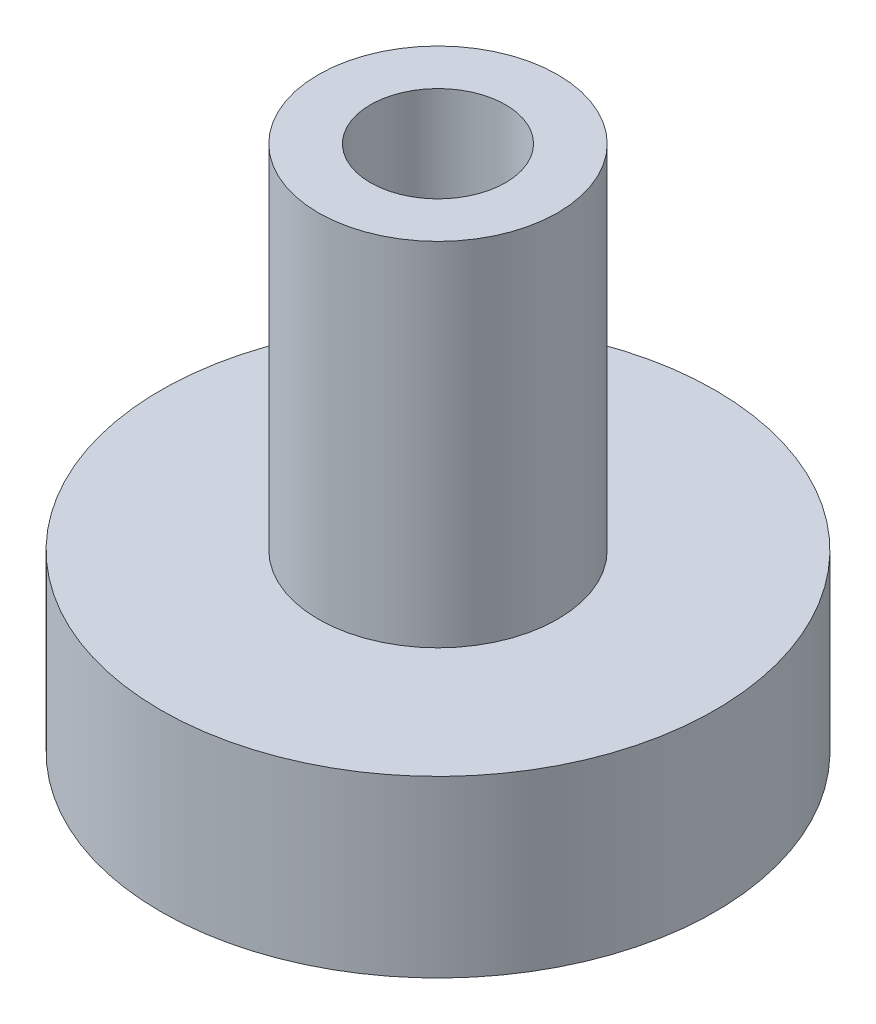
ISO-10303-21;
HEADER;
FILE_DESCRIPTION(('STEP AP214'),'2;1');
FILE_NAME('part.step','',(''),(''),'','','');
FILE_SCHEMA(('AUTOMOTIVE_DESIGN { 1 0 10303 214 1 1 1 1 }'));
ENDSEC;
DATA;
#1=APPLICATION_CONTEXT('core data for automotive mechanical design processes');
#2=APPLICATION_PROTOCOL_DEFINITION('international standard','automotive_design',2000,#1);
#3=PRODUCT_CONTEXT('',#1,'mechanical');
#4=PRODUCT('Part','Part','',(#3));
#5=PRODUCT_RELATED_PRODUCT_CATEGORY('part','',(#4));
#6=PRODUCT_DEFINITION_FORMATION('','',#4);
#7=PRODUCT_DEFINITION_CONTEXT('part definition',#1,'design');
#8=PRODUCT_DEFINITION('design','',#6,#7);
#9=PRODUCT_DEFINITION_SHAPE('','',#8);
#10=(LENGTH_UNIT() NAMED_UNIT(*) SI_UNIT(.MILLI.,.METRE.));
#11=(NAMED_UNIT(*) PLANE_ANGLE_UNIT() SI_UNIT($,.RADIAN.));
#12=(NAMED_UNIT(*) SI_UNIT($,.STERADIAN.) SOLID_ANGLE_UNIT());
#13=UNCERTAINTY_MEASURE_WITH_UNIT(LENGTH_MEASURE(1.E-05),#10,'distance_accuracy_value','');
#14=(GEOMETRIC_REPRESENTATION_CONTEXT(3) GLOBAL_UNCERTAINTY_ASSIGNED_CONTEXT((#13)) GLOBAL_UNIT_ASSIGNED_CONTEXT((#10,
#11,#12)) REPRESENTATION_CONTEXT('',''));
#15=CARTESIAN_POINT('',(0.,0.,0.));
#16=DIRECTION('',(0.,0.,1.));
#17=DIRECTION('',(1.,0.,0.));
#18=AXIS2_PLACEMENT_3D('',#15,#16,#17);
#19=CARTESIAN_POINT('',(0.,0.,0.));
#20=DIRECTION('',(0.,-1.,0.));
#21=DIRECTION('',(0.,0.,-1.));
#22=AXIS2_PLACEMENT_3D('',#19,#20,#21);
#23=PLANE('',#22);
#24=CARTESIAN_POINT('',(0.,0.,0.));
#25=DIRECTION('',(0.,1.,0.));
#26=DIRECTION('',(0.,0.,1.));
#27=AXIS2_PLACEMENT_3D('',#24,#25,#26);
#28=CIRCLE('',#27,1.2192);
#29=CARTESIAN_POINT('',(0.,0.,1.2192));
#30=VERTEX_POINT('',#29);
#31=EDGE_CURVE('E64',#30,#30,#28,.T.);
#32=ORIENTED_EDGE('',*,*,#31,.F.);
#33=EDGE_LOOP('',(#32));
#34=FACE_BOUND('',#33,.T.);
#35=CARTESIAN_POINT('',(0.,0.,0.));
#36=DIRECTION('',(0.,-1.,0.));
#37=DIRECTION('',(0.,0.,-1.));
#38=AXIS2_PLACEMENT_3D('',#35,#36,#37);
#39=CIRCLE('',#38,2.159);
#40=CARTESIAN_POINT('',(0.,0.,-2.159));
#41=VERTEX_POINT('',#40);
#42=EDGE_CURVE('E10',#41,#41,#39,.T.);
#43=ORIENTED_EDGE('',*,*,#42,.F.);
#44=EDGE_LOOP('',(#43));
#45=FACE_BOUND('',#44,.T.);
#46=ADVANCED_FACE('F37',(#34,#45),#23,.F.);
#47=CARTESIAN_POINT('',(0.,-9.5,0.));
#48=DIRECTION('',(0.,-1.,0.));
#49=DIRECTION('',(0.,0.,-1.));
#50=AXIS2_PLACEMENT_3D('',#47,#48,#49);
#51=CYLINDRICAL_SURFACE('',#50,2.159);
#52=CARTESIAN_POINT('',(0.,-6.35,0.));
#53=DIRECTION('',(0.,-1.,0.));
#54=DIRECTION('',(0.,0.,-1.));
#55=AXIS2_PLACEMENT_3D('',#52,#53,#54);
#56=CIRCLE('',#55,2.159);
#57=CARTESIAN_POINT('',(0.,-6.35,-2.159));
#58=VERTEX_POINT('',#57);
#59=EDGE_CURVE('E44',#58,#58,#56,.T.);
#60=ORIENTED_EDGE('',*,*,#59,.F.);
#61=EDGE_LOOP('',(#60));
#62=FACE_BOUND('',#61,.T.);
#63=ORIENTED_EDGE('',*,*,#42,.T.);
#64=EDGE_LOOP('',(#63));
#65=FACE_BOUND('',#64,.T.);
#66=ADVANCED_FACE('F74',(#62,#65),#51,.T.);
#67=CARTESIAN_POINT('',(-2.159,-6.35,0.));
#68=DIRECTION('',(0.,-1.,0.));
#69=DIRECTION('',(0.,0.,-1.));
#70=AXIS2_PLACEMENT_3D('',#67,#68,#69);
#71=PLANE('',#70);
#72=CARTESIAN_POINT('',(0.,-6.35,0.));
#73=DIRECTION('',(0.,-1.,0.));
#74=DIRECTION('',(0.,0.,-1.));
#75=AXIS2_PLACEMENT_3D('',#72,#73,#74);
#76=CIRCLE('',#75,5.);
#77=CARTESIAN_POINT('',(0.,-6.35,-5.));
#78=VERTEX_POINT('',#77);
#79=EDGE_CURVE('E49',#78,#78,#76,.T.);
#80=ORIENTED_EDGE('',*,*,#79,.F.);
#81=EDGE_LOOP('',(#80));
#82=FACE_BOUND('',#81,.T.);
#83=ORIENTED_EDGE('',*,*,#59,.T.);
#84=EDGE_LOOP('',(#83));
#85=FACE_BOUND('',#84,.T.);
#86=ADVANCED_FACE('F78',(#82,#85),#71,.F.);
#87=CARTESIAN_POINT('',(0.,-9.5,0.));
#88=DIRECTION('',(0.,-1.,0.));
#89=DIRECTION('',(0.,0.,-1.));
#90=AXIS2_PLACEMENT_3D('',#87,#88,#89);
#91=CYLINDRICAL_SURFACE('',#90,5.);
#92=CARTESIAN_POINT('',(0.,-9.5,0.));
#93=DIRECTION('',(0.,-1.,0.));
#94=DIRECTION('',(0.,0.,-1.));
#95=AXIS2_PLACEMENT_3D('',#92,#93,#94);
#96=CIRCLE('',#95,5.);
#97=CARTESIAN_POINT('',(0.,-9.5,-5.));
#98=VERTEX_POINT('',#97);
#99=EDGE_CURVE('E54',#98,#98,#96,.T.);
#100=ORIENTED_EDGE('',*,*,#99,.F.);
#101=EDGE_LOOP('',(#100));
#102=FACE_BOUND('',#101,.T.);
#103=ORIENTED_EDGE('',*,*,#79,.T.);
#104=EDGE_LOOP('',(#103));
#105=FACE_BOUND('',#104,.T.);
#106=ADVANCED_FACE('F83',(#102,#105),#91,.T.);
#107=CARTESIAN_POINT('',(-5.,-9.5,0.));
#108=DIRECTION('',(0.,1.,0.));
#109=DIRECTION('',(0.,0.,1.));
#110=AXIS2_PLACEMENT_3D('',#107,#108,#109);
#111=PLANE('',#110);
#112=CARTESIAN_POINT('',(0.,-9.5,0.));
#113=DIRECTION('',(0.,1.,0.));
#114=DIRECTION('',(0.,0.,1.));
#115=AXIS2_PLACEMENT_3D('',#112,#113,#114);
#116=CIRCLE('',#115,1.2192);
#117=CARTESIAN_POINT('',(0.,-9.5,1.2192));
#118=VERTEX_POINT('',#117);
#119=EDGE_CURVE('E60',#118,#118,#116,.F.);
#120=ORIENTED_EDGE('',*,*,#119,.F.);
#121=EDGE_LOOP('',(#120));
#122=FACE_BOUND('',#121,.T.);
#123=ORIENTED_EDGE('',*,*,#99,.T.);
#124=EDGE_LOOP('',(#123));
#125=FACE_BOUND('',#124,.T.);
#126=ADVANCED_FACE('F89',(#122,#125),#111,.F.);
#127=CARTESIAN_POINT('',(0.,-9.501,0.));
#128=DIRECTION('',(0.,1.,0.));
#129=DIRECTION('',(0.,0.,1.));
#130=AXIS2_PLACEMENT_3D('',#127,#128,#129);
#131=CYLINDRICAL_SURFACE('',#130,1.2192);
#132=ORIENTED_EDGE('',*,*,#31,.T.);
#133=EDGE_LOOP('',(#132));
#134=FACE_BOUND('',#133,.T.);
#135=ORIENTED_EDGE('',*,*,#119,.T.);
#136=EDGE_LOOP('',(#135));
#137=FACE_BOUND('',#136,.T.);
#138=ADVANCED_FACE('F69',(#134,#137),#131,.F.);
#139=CLOSED_SHELL('',(#46,#66,#86,#106,#126,#138));
#140=MANIFOLD_SOLID_BREP('B2',#139);
#141=ADVANCED_BREP_SHAPE_REPRESENTATION('',(#18,#140),#14);
#142=SHAPE_DEFINITION_REPRESENTATION(#9,#141);
ENDSEC;
END-ISO-10303-21;
